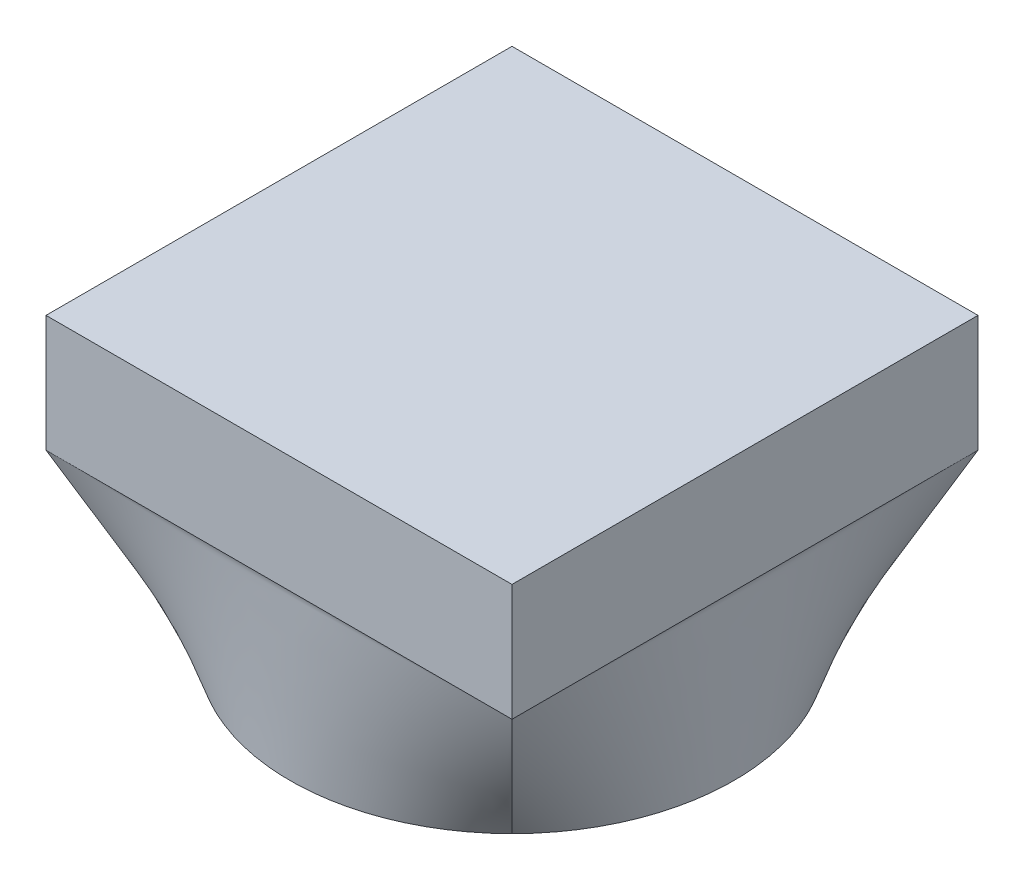
ISO-10303-21;
HEADER;
FILE_DESCRIPTION(('STEP AP214'),'2;1');
FILE_NAME('part.step','',(''),(''),'','','');
FILE_SCHEMA(('AUTOMOTIVE_DESIGN { 1 0 10303 214 1 1 1 1 }'));
ENDSEC;
DATA;
#1=APPLICATION_CONTEXT('core data for automotive mechanical design processes');
#2=APPLICATION_PROTOCOL_DEFINITION('international standard','automotive_design',2000,#1);
#3=PRODUCT_CONTEXT('',#1,'mechanical');
#4=PRODUCT('Part','Part','',(#3));
#5=PRODUCT_RELATED_PRODUCT_CATEGORY('part','',(#4));
#6=PRODUCT_DEFINITION_FORMATION('','',#4);
#7=PRODUCT_DEFINITION_CONTEXT('part definition',#1,'design');
#8=PRODUCT_DEFINITION('design','',#6,#7);
#9=PRODUCT_DEFINITION_SHAPE('','',#8);
#10=(LENGTH_UNIT() NAMED_UNIT(*) SI_UNIT(.MILLI.,.METRE.));
#11=(NAMED_UNIT(*) PLANE_ANGLE_UNIT() SI_UNIT($,.RADIAN.));
#12=(NAMED_UNIT(*) SI_UNIT($,.STERADIAN.) SOLID_ANGLE_UNIT());
#13=UNCERTAINTY_MEASURE_WITH_UNIT(LENGTH_MEASURE(1.E-05),#10,'distance_accuracy_value','');
#14=(GEOMETRIC_REPRESENTATION_CONTEXT(3) GLOBAL_UNCERTAINTY_ASSIGNED_CONTEXT((#13)) GLOBAL_UNIT_ASSIGNED_CONTEXT((#10,
#11,#12)) REPRESENTATION_CONTEXT('',''));
#15=CARTESIAN_POINT('',(0.,0.,0.));
#16=DIRECTION('',(0.,0.,1.));
#17=DIRECTION('',(1.,0.,0.));
#18=AXIS2_PLACEMENT_3D('',#15,#16,#17);
#19=CARTESIAN_POINT('',(0.,0.5,0.));
#20=DIRECTION('',(0.,-1.,0.));
#21=DIRECTION('',(0.,0.,-1.));
#22=AXIS2_PLACEMENT_3D('',#19,#20,#21);
#23=PLANE('',#22);
#24=CARTESIAN_POINT('',(0.,0.5,0.));
#25=DIRECTION('',(0.,-1.,0.));
#26=DIRECTION('',(0.,0.,-1.));
#27=AXIS2_PLACEMENT_3D('',#24,#25,#26);
#28=CIRCLE('',#27,6.86602540378444);
#29=CARTESIAN_POINT('',(0.,0.5,-6.86602540378444));
#30=VERTEX_POINT('',#29);
#31=EDGE_CURVE('E12',#30,#30,#28,.F.);
#32=ORIENTED_EDGE('',*,*,#31,.T.);
#33=EDGE_LOOP('',(#32));
#34=FACE_BOUND('',#33,.T.);
#35=CARTESIAN_POINT('',(6.7175144212722,0.5,-6.7175144212722));
#36=CARTESIAN_POINT('',(6.90300651074698,0.5,-6.53196568316095));
#37=CARTESIAN_POINT('',(7.08082919478799,0.5,-6.3387355064062));
#38=CARTESIAN_POINT('',(7.41990694543301,0.5,-5.938268848841));
#39=CARTESIAN_POINT('',(7.5811629987396,0.5,-5.73103320341146));
#40=CARTESIAN_POINT('',(7.88580839880782,0.5,-5.30401965513411));
#41=CARTESIAN_POINT('',(8.02920855368413,0.5,-5.08424945803837));
#42=CARTESIAN_POINT('',(8.2974001505958,0.5,-4.63360021934996));
#43=CARTESIAN_POINT('',(8.42219150037817,0.5,-4.40272112269252));
#44=CARTESIAN_POINT('',(8.59584911084859,0.5,-4.04707128404822));
#45=CARTESIAN_POINT('',(8.65194123204583,0.5,-3.92578045496589));
#46=CARTESIAN_POINT('',(8.75891814617632,0.5,-3.68092361255744));
#47=CARTESIAN_POINT('',(8.80980293558919,0.5,-3.55735759769326));
#48=CARTESIAN_POINT('',(8.9545676189336,0.5,-3.18361211438249));
#49=CARTESIAN_POINT('',(9.04058163339784,0.5,-2.93033639673166));
#50=CARTESIAN_POINT('',(9.19105454991117,0.5,-2.41752533703896));
#51=CARTESIAN_POINT('',(9.25551638224249,0.5,-2.15799085110165));
#52=CARTESIAN_POINT('',(9.36215700002169,0.5,-1.63438703119353));
#53=CARTESIAN_POINT('',(9.4043359782232,0.5,-1.37031773647064));
#54=CARTESIAN_POINT('',(9.46641842680962,0.5,-0.839844175415977));
#55=CARTESIAN_POINT('',(9.48634661268615,0.5,-0.573442831748017));
#56=CARTESIAN_POINT('',(9.49934263708747,0.5,-0.173352287448569));
#57=CARTESIAN_POINT('',(9.50085781792093,0.5,-0.039892222514214));
#58=CARTESIAN_POINT('',(9.49821245225879,0.5,0.226971912535523));
#59=CARTESIAN_POINT('',(9.4940518701228,0.5,0.360375982294027));
#60=CARTESIAN_POINT('',(9.47316806180636,0.5,0.760178258755879));
#61=CARTESIAN_POINT('',(9.44804334386136,0.5,1.02618451527658));
#62=CARTESIAN_POINT('',(9.37557644209928,0.5,1.55512165677982));
#63=CARTESIAN_POINT('',(9.32823459128378,0.5,1.81805258779635));
#64=CARTESIAN_POINT('',(9.21137624255906,0.5,2.33914102224138));
#65=CARTESIAN_POINT('',(9.14184405024454,0.5,2.59729500998239));
#66=CARTESIAN_POINT('',(8.98144078615444,0.5,3.10690129125351));
#67=CARTESIAN_POINT('',(8.8905684472608,0.5,3.35835318584452));
#68=CARTESIAN_POINT('',(8.68788921287397,0.5,3.85252457294979));
#69=CARTESIAN_POINT('',(8.57609281841009,0.5,4.09524837325235));
#70=CARTESIAN_POINT('',(8.33251254082136,0.5,4.57043816222572));
#71=CARTESIAN_POINT('',(8.20073081745608,0.5,4.80290525581053));
#72=CARTESIAN_POINT('',(7.96402170854364,0.5,5.18231400915458));
#73=CARTESIAN_POINT('',(7.86427190542111,0.5,5.33251293162386));
#74=CARTESIAN_POINT('',(7.65636447383926,0.5,5.62694084069753));
#75=CARTESIAN_POINT('',(7.54820857442066,0.5,5.77117104569698));
#76=CARTESIAN_POINT('',(7.3240486557897,0.5,6.05306969086165));
#77=CARTESIAN_POINT('',(7.20805563336533,0.5,6.19074688163188));
#78=CARTESIAN_POINT('',(6.96842469610688,0.5,6.45933024422766));
#79=CARTESIAN_POINT('',(6.84478519676399,0.5,6.59023500227353));
#80=CARTESIAN_POINT('',(6.7175144212722,0.5,6.7175144212722));
#81=B_SPLINE_CURVE_WITH_KNOTS('',3,(#35,#36,#37,#38,#39,#40,#41,#42,#43,#44,#45,#46,#47,#48,#49,
#50,#51,#52,#53,#54,#55,#56,#57,#58,#59,#60,#61,#62,#63,#64,#65,#66,#67,#68,#69,#70,#71,#72,#73,
#74,#75,#76,#77,#78,#79,#80),.UNSPECIFIED.,.F.,.F.,(4,2,2,2,2,2,2,2,2,2,2,2,2,2,2,2,2,2,2,2,2,2,
4),(0.,0.786892929638783,1.57373896501321,2.36010638570078,3.14647770466848,3.54727241249081,
3.94806739126557,4.74949495785004,5.55081351622108,6.35212514282349,7.15254580904471,
7.55284674077699,7.95315018617001,8.75370327486,9.55424436483984,10.3553529073075,
11.1565090293859,11.9572641530042,12.7579328027999,13.2985776240309,13.8391115334338,
14.3789021329941,14.9188049656204),.UNSPECIFIED.);
#82=CARTESIAN_POINT('',(6.7175144212722,0.5,-6.7175144212722));
#83=VERTEX_POINT('',#82);
#84=CARTESIAN_POINT('',(6.7175144212722,0.5,6.7175144212722));
#85=VERTEX_POINT('',#84);
#86=EDGE_CURVE('E101',#83,#85,#81,.T.);
#87=ORIENTED_EDGE('',*,*,#86,.T.);
#88=CARTESIAN_POINT('',(-6.7175144212722,0.5,6.7175144212722));
#89=CARTESIAN_POINT('',(-6.53196568316094,0.5,6.90300651074699));
#90=CARTESIAN_POINT('',(-6.33873550640619,0.5,7.080829194788));
#91=CARTESIAN_POINT('',(-5.93826884884098,0.5,7.41990694543302));
#92=CARTESIAN_POINT('',(-5.73103320341144,0.5,7.58116299873962));
#93=CARTESIAN_POINT('',(-5.30401965513409,0.5,7.88580839880784));
#94=CARTESIAN_POINT('',(-5.08424945803834,0.5,8.02920855368415));
#95=CARTESIAN_POINT('',(-4.63360021934992,0.5,8.29740015059582));
#96=CARTESIAN_POINT('',(-4.40272112269248,0.5,8.42219150037819));
#97=CARTESIAN_POINT('',(-4.04707128404817,0.5,8.59584911084862));
#98=CARTESIAN_POINT('',(-3.92578045496584,0.5,8.65194123204586));
#99=CARTESIAN_POINT('',(-3.68092361255738,0.5,8.75891814617635));
#100=CARTESIAN_POINT('',(-3.55735759769319,0.5,8.80980293558922));
#101=CARTESIAN_POINT('',(-3.18361211438241,0.5,8.95456761893364));
#102=CARTESIAN_POINT('',(-2.93033639673157,0.5,9.04058163339787));
#103=CARTESIAN_POINT('',(-2.41752533703884,0.5,9.1910545499112));
#104=CARTESIAN_POINT('',(-2.15799085110152,0.5,9.25551638224252));
#105=CARTESIAN_POINT('',(-1.63438703119338,0.5,9.36215700002171));
#106=CARTESIAN_POINT('',(-1.37031773647048,0.5,9.40433597822322));
#107=CARTESIAN_POINT('',(-0.839844175415804,0.5,9.46641842680963));
#108=CARTESIAN_POINT('',(-0.573442831747839,0.5,9.48634661268616));
#109=CARTESIAN_POINT('',(-0.173352287448387,0.5,9.49934263708748));
#110=CARTESIAN_POINT('',(-0.0398922225140296,0.5,9.50085781792093));
#111=CARTESIAN_POINT('',(0.226971912535711,0.5,9.49821245225878));
#112=CARTESIAN_POINT('',(0.360375982294216,0.5,9.49405187012279));
#113=CARTESIAN_POINT('',(0.760178258756073,0.5,9.47316806180634));
#114=CARTESIAN_POINT('',(1.02618451527678,0.5,9.44804334386134));
#115=CARTESIAN_POINT('',(1.55512165678002,0.5,9.37557644209925));
#116=CARTESIAN_POINT('',(1.81805258779655,0.5,9.32823459128375));
#117=CARTESIAN_POINT('',(2.33914102224158,0.5,9.211376242559));
#118=CARTESIAN_POINT('',(2.59729500998259,0.5,9.14184405024449));
#119=CARTESIAN_POINT('',(3.1069012912537,0.5,8.98144078615437));
#120=CARTESIAN_POINT('',(3.3583531858447,0.5,8.89056844726073));
#121=CARTESIAN_POINT('',(3.85252457294997,0.5,8.68788921287389));
#122=CARTESIAN_POINT('',(4.09524837325252,0.5,8.57609281841001));
#123=CARTESIAN_POINT('',(4.57043816222588,0.5,8.33251254082127));
#124=CARTESIAN_POINT('',(4.80290525581069,0.5,8.20073081745599));
#125=CARTESIAN_POINT('',(5.18231400915472,0.5,7.96402170854355));
#126=CARTESIAN_POINT('',(5.33251293162399,0.5,7.86427190542103));
#127=CARTESIAN_POINT('',(5.62694084069763,0.5,7.65636447383919));
#128=CARTESIAN_POINT('',(5.77117104569707,0.5,7.54820857442059));
#129=CARTESIAN_POINT('',(6.05306969086171,0.5,7.32404865578965));
#130=CARTESIAN_POINT('',(6.19074688163193,0.5,7.20805563336529));
#131=CARTESIAN_POINT('',(6.45933024422768,0.5,6.96842469610686));
#132=CARTESIAN_POINT('',(6.59023500227354,0.5,6.84478519676398));
#133=CARTESIAN_POINT('',(6.7175144212722,0.5,6.7175144212722));
#134=B_SPLINE_CURVE_WITH_KNOTS('',3,(#88,#89,#90,#91,#92,#93,#94,#95,#96,#97,#98,#99,#100,#101,
#102,#103,#104,#105,#106,#107,#108,#109,#110,#111,#112,#113,#114,#115,#116,#117,#118,#119,#120,
#121,#122,#123,#124,#125,#126,#127,#128,#129,#130,#131,#132,#133),.UNSPECIFIED.,.F.,.F.,(4,2,2,
2,2,2,2,2,2,2,2,2,2,2,2,2,2,2,2,2,2,2,4),(0.,0.786892929638797,1.57373896501323,
2.36010638570082,3.14647770466853,3.54727241249088,3.94806739126565,4.74949495785015,
5.55081351622122,6.35212514282366,7.15254580904489,7.55284674077717,7.9531501861702,
8.7537032748602,9.55424436484005,10.3553529073077,11.1565090293861,11.9572641530044,
12.7579328028001,13.298577624031,13.8391115334339,14.3789021329942,14.9188049656204),.UNSPECIFIED.);
#135=CARTESIAN_POINT('',(-6.7175144212722,0.5,6.7175144212722));
#136=VERTEX_POINT('',#135);
#137=EDGE_CURVE('E198',#136,#85,#134,.T.);
#138=ORIENTED_EDGE('',*,*,#137,.F.);
#139=CARTESIAN_POINT('',(-6.7175144212722,0.5,-6.7175144212722));
#140=CARTESIAN_POINT('',(-6.90300651074699,0.5,-6.53196568316095));
#141=CARTESIAN_POINT('',(-7.080829194788,0.5,-6.33873550640619));
#142=CARTESIAN_POINT('',(-7.41990694543302,0.5,-5.93826884884099));
#143=CARTESIAN_POINT('',(-7.58116299873961,0.5,-5.73103320341145));
#144=CARTESIAN_POINT('',(-7.88580839880783,0.5,-5.3040196551341));
#145=CARTESIAN_POINT('',(-8.02920855368414,0.5,-5.08424945803835));
#146=CARTESIAN_POINT('',(-8.29740015059581,0.5,-4.63360021934994));
#147=CARTESIAN_POINT('',(-8.42219150037818,0.5,-4.4027211226925));
#148=CARTESIAN_POINT('',(-8.59584911084861,0.5,-4.04707128404819));
#149=CARTESIAN_POINT('',(-8.65194123204585,0.5,-3.92578045496586));
#150=CARTESIAN_POINT('',(-8.75891814617634,0.5,-3.6809236125574));
#151=CARTESIAN_POINT('',(-8.80980293558921,0.5,-3.55735759769322));
#152=CARTESIAN_POINT('',(-8.95456761893363,0.5,-3.18361211438243));
#153=CARTESIAN_POINT('',(-9.04058163339787,0.5,-2.93033639673159));
#154=CARTESIAN_POINT('',(-9.19105454991119,0.5,-2.41752533703887));
#155=CARTESIAN_POINT('',(-9.25551638224251,0.5,-2.15799085110154));
#156=CARTESIAN_POINT('',(-9.36215700002171,0.5,-1.63438703119341));
#157=CARTESIAN_POINT('',(-9.40433597822322,0.5,-1.3703177364705));
#158=CARTESIAN_POINT('',(-9.46641842680963,0.5,-0.839844175415837));
#159=CARTESIAN_POINT('',(-9.48634661268616,0.5,-0.573442831747878));
#160=CARTESIAN_POINT('',(-9.49934263708747,0.5,-0.173352287448433));
#161=CARTESIAN_POINT('',(-9.50085781792093,0.5,-0.0398922225140783));
#162=CARTESIAN_POINT('',(-9.49821245225878,0.5,0.226971912535657));
#163=CARTESIAN_POINT('',(-9.4940518701228,0.5,0.36037598229416));
#164=CARTESIAN_POINT('',(-9.47316806180635,0.5,0.760178258756009));
#165=CARTESIAN_POINT('',(-9.44804334386134,0.5,1.02618451527671));
#166=CARTESIAN_POINT('',(-9.37557644209926,0.5,1.55512165677994));
#167=CARTESIAN_POINT('',(-9.32823459128376,0.5,1.81805258779647));
#168=CARTESIAN_POINT('',(-9.21137624255902,0.5,2.33914102224149));
#169=CARTESIAN_POINT('',(-9.14184405024451,0.5,2.59729500998251));
#170=CARTESIAN_POINT('',(-8.9814407861544,0.5,3.10690129125362));
#171=CARTESIAN_POINT('',(-8.89056844726076,0.5,3.35835318584463));
#172=CARTESIAN_POINT('',(-8.68788921287393,0.5,3.8525245729499));
#173=CARTESIAN_POINT('',(-8.57609281841005,0.5,4.09524837325245));
#174=CARTESIAN_POINT('',(-8.33251254082131,0.5,4.57043816222582));
#175=CARTESIAN_POINT('',(-8.20073081745603,0.5,4.80290525581062));
#176=CARTESIAN_POINT('',(-7.96402170854359,0.5,5.18231400915466));
#177=CARTESIAN_POINT('',(-7.86427190542106,0.5,5.33251293162394));
#178=CARTESIAN_POINT('',(-7.65636447383922,0.5,5.62694084069759));
#179=CARTESIAN_POINT('',(-7.54820857442062,0.5,5.77117104569704));
#180=CARTESIAN_POINT('',(-7.32404865578967,0.5,6.05306969086169));
#181=CARTESIAN_POINT('',(-7.2080556333653,0.5,6.19074688163191));
#182=CARTESIAN_POINT('',(-6.96842469610687,0.5,6.45933024422767));
#183=CARTESIAN_POINT('',(-6.84478519676399,0.5,6.59023500227354));
#184=CARTESIAN_POINT('',(-6.7175144212722,0.5,6.7175144212722));
#185=B_SPLINE_CURVE_WITH_KNOTS('',3,(#139,#140,#141,#142,#143,#144,#145,#146,#147,#148,#149,
#150,#151,#152,#153,#154,#155,#156,#157,#158,#159,#160,#161,#162,#163,#164,#165,#166,#167,#168,
#169,#170,#171,#172,#173,#174,#175,#176,#177,#178,#179,#180,#181,#182,#183,#184),.UNSPECIFIED.,
.F.,.F.,(4,2,2,2,2,2,2,2,2,2,2,2,2,2,2,2,2,2,2,2,2,2,4),(0.,0.786892929638792,1.57373896501322,
2.3601063857008,3.14647770466851,3.54727241249085,3.94806739126562,4.74949495785013,
5.55081351622119,6.35212514282363,7.15254580904484,7.55284674077712,7.95315018617014,
8.75370327486013,9.55424436483996,10.3553529073076,11.156509029386,11.9572641530043,
12.7579328028,13.298577624031,13.8391115334339,14.3789021329942,14.9188049656204),.UNSPECIFIED.);
#186=CARTESIAN_POINT('',(-6.7175144212722,0.5,-6.7175144212722));
#187=VERTEX_POINT('',#186);
#188=EDGE_CURVE('E222',#187,#136,#185,.T.);
#189=ORIENTED_EDGE('',*,*,#188,.F.);
#190=CARTESIAN_POINT('',(6.7175144212722,0.5,-6.7175144212722));
#191=CARTESIAN_POINT('',(6.53196568316096,0.5,-6.90300651074698));
#192=CARTESIAN_POINT('',(6.33873550640621,0.5,-7.08082919478798));
#193=CARTESIAN_POINT('',(5.93826884884102,0.5,-7.41990694543299));
#194=CARTESIAN_POINT('',(5.73103320341149,0.5,-7.58116299873958));
#195=CARTESIAN_POINT('',(5.30401965513416,0.5,-7.88580839880779));
#196=CARTESIAN_POINT('',(5.08424945803842,0.5,-8.0292085536841));
#197=CARTESIAN_POINT('',(4.63360021935003,0.5,-8.29740015059576));
#198=CARTESIAN_POINT('',(4.4027211226926,0.5,-8.42219150037812));
#199=CARTESIAN_POINT('',(4.04707128404831,0.5,-8.59584911084855));
#200=CARTESIAN_POINT('',(3.92578045496598,0.5,-8.65194123204579));
#201=CARTESIAN_POINT('',(3.68092361255753,0.5,-8.75891814617628));
#202=CARTESIAN_POINT('',(3.55735759769335,0.5,-8.80980293558915));
#203=CARTESIAN_POINT('',(3.18361211438258,0.5,-8.95456761893357));
#204=CARTESIAN_POINT('',(2.93033639673176,0.5,-9.04058163339781));
#205=CARTESIAN_POINT('',(2.41752533703905,0.5,-9.19105454991114));
#206=CARTESIAN_POINT('',(2.15799085110174,0.5,-9.25551638224246));
#207=CARTESIAN_POINT('',(1.63438703119363,0.5,-9.36215700002167));
#208=CARTESIAN_POINT('',(1.37031773647074,0.5,-9.40433597822319));
#209=CARTESIAN_POINT('',(0.839844175416073,0.5,-9.46641842680961));
#210=CARTESIAN_POINT('',(0.573442831748105,0.5,-9.48634661268614));
#211=CARTESIAN_POINT('',(0.173352287448647,0.5,-9.49934263708747));
#212=CARTESIAN_POINT('',(0.0398922225142885,0.5,-9.50085781792093));
#213=CARTESIAN_POINT('',(-0.226971912535455,0.5,-9.49821245225879));
#214=CARTESIAN_POINT('',(-0.360375982293963,0.5,-9.4940518701228));
#215=CARTESIAN_POINT('',(-0.760178258755826,0.5,-9.47316806180636));
#216=CARTESIAN_POINT('',(-1.02618451527654,0.5,-9.44804334386137));
#217=CARTESIAN_POINT('',(-1.55512165677979,0.5,-9.37557644209929));
#218=CARTESIAN_POINT('',(-1.81805258779632,0.5,-9.32823459128379));
#219=CARTESIAN_POINT('',(-2.33914102224135,0.5,-9.21137624255906));
#220=CARTESIAN_POINT('',(-2.59729500998237,0.5,-9.14184405024455));
#221=CARTESIAN_POINT('',(-3.10690129125347,0.5,-8.98144078615445));
#222=CARTESIAN_POINT('',(-3.35835318584448,0.5,-8.89056844726081));
#223=CARTESIAN_POINT('',(-3.85252457294974,0.5,-8.687889212874));
#224=CARTESIAN_POINT('',(-4.0952483732523,0.5,-8.57609281841011));
#225=CARTESIAN_POINT('',(-4.57043816222566,0.5,-8.33251254082139));
#226=CARTESIAN_POINT('',(-4.80290525581047,0.5,-8.20073081745612));
#227=CARTESIAN_POINT('',(-5.18231400915452,0.5,-7.96402170854368));
#228=CARTESIAN_POINT('',(-5.33251293162381,0.5,-7.86427190542115));
#229=CARTESIAN_POINT('',(-5.62694084069749,0.5,-7.65636447383929));
#230=CARTESIAN_POINT('',(-5.77117104569695,0.5,-7.54820857442069));
#231=CARTESIAN_POINT('',(-6.05306969086163,0.5,-7.32404865578972));
#232=CARTESIAN_POINT('',(-6.19074688163187,0.5,-7.20805563336534));
#233=CARTESIAN_POINT('',(-6.45933024422765,0.5,-6.96842469610689));
#234=CARTESIAN_POINT('',(-6.59023500227353,0.5,-6.844785196764));
#235=CARTESIAN_POINT('',(-6.7175144212722,0.5,-6.7175144212722));
#236=B_SPLINE_CURVE_WITH_KNOTS('',3,(#190,#191,#192,#193,#194,#195,#196,#197,#198,#199,#200,
#201,#202,#203,#204,#205,#206,#207,#208,#209,#210,#211,#212,#213,#214,#215,#216,#217,#218,#219,
#220,#221,#222,#223,#224,#225,#226,#227,#228,#229,#230,#231,#232,#233,#234,#235),.UNSPECIFIED.,
.F.,.F.,(4,2,2,2,2,2,2,2,2,2,2,2,2,2,2,2,2,2,2,2,2,2,4),(0.,0.78689292963876,1.57373896501316,
2.36010638570071,3.14647770466839,3.54727241249071,3.94806739126547,4.74949495784994,
5.55081351622098,6.35212514282338,7.15254580904463,7.55284674077691,7.95315018616995,
8.75370327485996,9.55424436483982,10.3553529073074,11.1565090293859,11.9572641530042,
12.7579328027998,13.2985776240308,13.8391115334338,14.3789021329941,14.9188049656204),.UNSPECIFIED.);
#237=EDGE_CURVE('E186',#83,#187,#236,.T.);
#238=ORIENTED_EDGE('',*,*,#237,.F.);
#239=EDGE_LOOP('',(#87,#138,#189,#238));
#240=FACE_BOUND('',#239,.T.);
#241=ADVANCED_FACE('F66',(#34,#240),#23,.T.);
#242=CARTESIAN_POINT('',(0.,0.,0.));
#243=DIRECTION('',(0.,1.,0.));
#244=DIRECTION('',(0.,0.,1.));
#245=AXIS2_PLACEMENT_3D('',#242,#243,#244);
#246=PLANE('',#245);
#247=CARTESIAN_POINT('',(0.,0.,0.));
#248=DIRECTION('',(0.,-1.,0.));
#249=DIRECTION('',(0.,0.,-1.));
#250=AXIS2_PLACEMENT_3D('',#247,#248,#249);
#251=CIRCLE('',#250,3.9);
#252=CARTESIAN_POINT('',(0.,0.,-3.9));
#253=VERTEX_POINT('',#252);
#254=EDGE_CURVE('E335',#253,#253,#251,.T.);
#255=ORIENTED_EDGE('',*,*,#254,.F.);
#256=EDGE_LOOP('',(#255));
#257=FACE_BOUND('',#256,.T.);
#258=CARTESIAN_POINT('',(0.,0.,0.));
#259=DIRECTION('',(0.,-1.,0.));
#260=DIRECTION('',(0.,0.,-1.));
#261=AXIS2_PLACEMENT_3D('',#258,#259,#260);
#262=CIRCLE('',#261,6.);
#263=CARTESIAN_POINT('',(0.,0.,-6.));
#264=VERTEX_POINT('',#263);
#265=EDGE_CURVE('E75',#264,#264,#262,.T.);
#266=ORIENTED_EDGE('',*,*,#265,.T.);
#267=EDGE_LOOP('',(#266));
#268=FACE_BOUND('',#267,.T.);
#269=ADVANCED_FACE('F213',(#257,#268),#246,.F.);
#270=CARTESIAN_POINT('',(6.7175144212722,0.5,-6.7175144212722));
#271=CARTESIAN_POINT('',(9.975,8.,-9.975));
#272=CARTESIAN_POINT('',(6.32168108793887,0.5,-7.11334775460554));
#273=CARTESIAN_POINT('',(9.14375000000001,8.,-9.975));
#274=CARTESIAN_POINT('',(5.87585631433432,0.5,-7.48879518154313));
#275=CARTESIAN_POINT('',(8.31250000000002,8.,-9.975));
#276=CARTESIAN_POINT('',(4.89020081393652,0.5,-8.16661966159688));
#277=CARTESIAN_POINT('',(6.65000000000003,8.,-9.975));
#278=CARTESIAN_POINT('',(4.35031975216273,0.5,-8.46877725249614));
#279=CARTESIAN_POINT('',(5.81875000000003,8.,-9.975));
#280=CARTESIAN_POINT('',(3.19604985031962,0.5,-8.96831842948973));
#281=CARTESIAN_POINT('',(4.15625000000004,8.,-9.975));
#282=CARTESIAN_POINT('',(2.58175137902643,0.5,-9.16545716669191));
#283=CARTESIAN_POINT('',(3.32500000000005,8.,-9.975));
#284=CARTESIAN_POINT('',(1.31152863562535,0.5,-9.43138048726186));
#285=CARTESIAN_POINT('',(1.66250000000005,8.,-9.975));
#286=CARTESIAN_POINT('',(0.655838140424066,0.5,-9.5));
#287=CARTESIAN_POINT('',(0.831250000000053,8.,-9.975));
#288=CARTESIAN_POINT('',(-0.655838140424068,0.5,-9.5));
#289=CARTESIAN_POINT('',(-0.831249999999947,8.,-9.975));
#290=CARTESIAN_POINT('',(-1.31152863562535,0.5,-9.43138048726186));
#291=CARTESIAN_POINT('',(-1.66249999999995,8.,-9.975));
#292=CARTESIAN_POINT('',(-2.58175137902643,0.5,-9.16545716669191));
#293=CARTESIAN_POINT('',(-3.32499999999996,8.,-9.975));
#294=CARTESIAN_POINT('',(-3.19604985031962,0.5,-8.96831842948973));
#295=CARTESIAN_POINT('',(-4.15624999999996,8.,-9.975));
#296=CARTESIAN_POINT('',(-4.35031975216273,0.5,-8.46877725249614));
#297=CARTESIAN_POINT('',(-5.81874999999997,8.,-9.975));
#298=CARTESIAN_POINT('',(-4.89020081393652,0.5,-8.16661966159688));
#299=CARTESIAN_POINT('',(-6.64999999999997,8.,-9.975));
#300=CARTESIAN_POINT('',(-5.87585631433433,0.5,-7.48879518154313));
#301=CARTESIAN_POINT('',(-8.31249999999998,8.,-9.975));
#302=CARTESIAN_POINT('',(-6.32168108793887,0.5,-7.11334775460553));
#303=CARTESIAN_POINT('',(-9.14374999999999,8.,-9.975));
#304=CARTESIAN_POINT('',(-6.7175144212722,0.5,-6.7175144212722));
#305=CARTESIAN_POINT('',(-9.975,8.,-9.975));
#306=B_SPLINE_SURFACE_WITH_KNOTS('',3,1,((#270,#271),(#272,#273),(#274,#275),(#276,#277),(#278,
#279),(#280,#281),(#282,#283),(#284,#285),(#286,#287),(#288,#289),(#290,#291),(#292,#293),(#294,
#295),(#296,#297),(#298,#299),(#300,#301),(#302,#303),(#304,#305)),.UNSPECIFIED.,.F.,.F.,.F.,(4,
2,2,2,2,2,2,2,4),(2,2),(0.,0.125,0.25,0.375,0.5,0.625,0.75,0.875,1.),(0.,1.),.UNSPECIFIED.);
#307=DIRECTION('',(-0.370091344143309,0.852094357439596,-0.370091344143309));
#308=VECTOR('',#307,1.);
#309=CARTESIAN_POINT('',(-8.3462572106361,4.25,-8.3462572106361));
#310=LINE('',#309,#308);
#311=CARTESIAN_POINT('',(-9.975,8.,-9.975));
#312=VERTEX_POINT('',#311);
#313=EDGE_CURVE('E83',#187,#312,#310,.T.);
#314=CARTESIAN_POINT('',(-9.975,8.,-9.975));
#315=CARTESIAN_POINT('',(-9.14374999999999,8.,-9.975));
#316=CARTESIAN_POINT('',(-8.31249999999998,8.,-9.975));
#317=CARTESIAN_POINT('',(-6.64999999999997,8.,-9.975));
#318=CARTESIAN_POINT('',(-5.81874999999997,8.,-9.975));
#319=CARTESIAN_POINT('',(-4.15624999999996,8.,-9.975));
#320=CARTESIAN_POINT('',(-3.32499999999996,8.,-9.975));
#321=CARTESIAN_POINT('',(-1.66249999999995,8.,-9.975));
#322=CARTESIAN_POINT('',(-0.831249999999947,8.,-9.975));
#323=CARTESIAN_POINT('',(0.831250000000053,8.,-9.975));
#324=CARTESIAN_POINT('',(1.66250000000005,8.,-9.975));
#325=CARTESIAN_POINT('',(3.32500000000005,8.,-9.975));
#326=CARTESIAN_POINT('',(4.15625000000004,8.,-9.975));
#327=CARTESIAN_POINT('',(5.81875000000003,8.,-9.975));
#328=CARTESIAN_POINT('',(6.65000000000003,8.,-9.975));
#329=CARTESIAN_POINT('',(8.31250000000002,8.,-9.975));
#330=CARTESIAN_POINT('',(9.14375000000001,8.,-9.975));
#331=CARTESIAN_POINT('',(9.975,8.,-9.975));
#332=B_SPLINE_CURVE_WITH_KNOTS('',3,(#314,#315,#316,#317,#318,#319,#320,#321,#322,#323,#324,
#325,#326,#327,#328,#329,#330,#331),.UNSPECIFIED.,.F.,.F.,(4,2,2,2,2,2,2,2,4),(0.,0.125,0.25,
0.375,0.5,0.625,0.75,0.875,1.),.UNSPECIFIED.);
#333=CARTESIAN_POINT('',(9.975,8.,-9.975));
#334=VERTEX_POINT('',#333);
#335=EDGE_CURVE('E263',#312,#334,#332,.T.);
#336=DIRECTION('',(-0.370091344143308,-0.852094357439596,0.370091344143308));
#337=VECTOR('',#336,1.);
#338=CARTESIAN_POINT('',(8.3462572106361,4.25,-8.3462572106361));
#339=LINE('',#338,#337);
#340=EDGE_CURVE('E286',#334,#83,#339,.T.);
#341=ORIENTED_EDGE('',*,*,#237,.T.);
#342=ORIENTED_EDGE('',*,*,#313,.T.);
#343=ORIENTED_EDGE('',*,*,#335,.T.);
#344=ORIENTED_EDGE('',*,*,#340,.T.);
#345=EDGE_LOOP('',(#341,#342,#343,#344));
#346=FACE_BOUND('',#345,.T.);
#347=ADVANCED_FACE('F205',(#346),#306,.T.);
#348=CARTESIAN_POINT('',(-6.7175144212722,0.5,-6.7175144212722));
#349=CARTESIAN_POINT('',(-9.975,8.,-9.975));
#350=CARTESIAN_POINT('',(-7.11334775460553,0.5,-6.32168108793886));
#351=CARTESIAN_POINT('',(-9.975,8.,-9.14374999999999));
#352=CARTESIAN_POINT('',(-7.48879518154313,0.5,-5.87585631433432));
#353=CARTESIAN_POINT('',(-9.975,8.,-8.31249999999999));
#354=CARTESIAN_POINT('',(-8.16661966159688,0.5,-4.89020081393652));
#355=CARTESIAN_POINT('',(-9.975,8.,-6.64999999999998));
#356=CARTESIAN_POINT('',(-8.46877725249615,0.5,-4.35031975216273));
#357=CARTESIAN_POINT('',(-9.975,8.,-5.81874999999998));
#358=CARTESIAN_POINT('',(-8.96831842948974,0.5,-3.19604985031962));
#359=CARTESIAN_POINT('',(-9.975,8.,-4.15624999999998));
#360=CARTESIAN_POINT('',(-9.16545716669192,0.5,-2.58175137902643));
#361=CARTESIAN_POINT('',(-9.975,8.,-3.32499999999997));
#362=CARTESIAN_POINT('',(-9.43138048726186,0.5,-1.31152863562534));
#363=CARTESIAN_POINT('',(-9.975,8.,-1.66249999999997));
#364=CARTESIAN_POINT('',(-9.5,0.5,-0.655838140424065));
#365=CARTESIAN_POINT('',(-9.975,8.,-0.831249999999971));
#366=CARTESIAN_POINT('',(-9.5,0.5,0.655838140424069));
#367=CARTESIAN_POINT('',(-9.975,8.,0.831250000000028));
#368=CARTESIAN_POINT('',(-9.43138048726186,0.5,1.31152863562535));
#369=CARTESIAN_POINT('',(-9.975,8.,1.66250000000003));
#370=CARTESIAN_POINT('',(-9.16545716669191,0.5,2.58175137902643));
#371=CARTESIAN_POINT('',(-9.975,8.,3.32500000000003));
#372=CARTESIAN_POINT('',(-8.96831842948973,0.5,3.19604985031962));
#373=CARTESIAN_POINT('',(-9.975,8.,4.15625000000002));
#374=CARTESIAN_POINT('',(-8.46877725249614,0.5,4.35031975216273));
#375=CARTESIAN_POINT('',(-9.975,8.,5.81875000000002));
#376=CARTESIAN_POINT('',(-8.16661966159688,0.5,4.89020081393652));
#377=CARTESIAN_POINT('',(-9.975,8.,6.65000000000002));
#378=CARTESIAN_POINT('',(-7.48879518154313,0.5,5.87585631433433));
#379=CARTESIAN_POINT('',(-9.975,8.,8.31250000000001));
#380=CARTESIAN_POINT('',(-7.11334775460554,0.5,6.32168108793887));
#381=CARTESIAN_POINT('',(-9.975,8.,9.14375000000001));
#382=CARTESIAN_POINT('',(-6.7175144212722,0.5,6.7175144212722));
#383=CARTESIAN_POINT('',(-9.975,8.,9.975));
#384=B_SPLINE_SURFACE_WITH_KNOTS('',3,1,((#348,#349),(#350,#351),(#352,#353),(#354,#355),(#356,
#357),(#358,#359),(#360,#361),(#362,#363),(#364,#365),(#366,#367),(#368,#369),(#370,#371),(#372,
#373),(#374,#375),(#376,#377),(#378,#379),(#380,#381),(#382,#383)),.UNSPECIFIED.,.F.,.F.,.F.,(4,
2,2,2,2,2,2,2,4),(2,2),(0.,0.125,0.25,0.375,0.5,0.625,0.75,0.875,1.),(0.,1.),.UNSPECIFIED.);
#385=DIRECTION('',(-0.370091344143309,0.852094357439596,0.370091344143309));
#386=VECTOR('',#385,1.);
#387=CARTESIAN_POINT('',(-8.3462572106361,4.25,8.3462572106361));
#388=LINE('',#387,#386);
#389=CARTESIAN_POINT('',(-9.975,8.,9.975));
#390=VERTEX_POINT('',#389);
#391=EDGE_CURVE('E107',#136,#390,#388,.T.);
#392=CARTESIAN_POINT('',(-9.975,8.,9.975));
#393=CARTESIAN_POINT('',(-9.975,8.,9.14375000000001));
#394=CARTESIAN_POINT('',(-9.975,8.,8.31250000000001));
#395=CARTESIAN_POINT('',(-9.975,8.,6.65000000000002));
#396=CARTESIAN_POINT('',(-9.975,8.,5.81875000000002));
#397=CARTESIAN_POINT('',(-9.975,8.,4.15625000000002));
#398=CARTESIAN_POINT('',(-9.975,8.,3.32500000000003));
#399=CARTESIAN_POINT('',(-9.975,8.,1.66250000000003));
#400=CARTESIAN_POINT('',(-9.975,8.,0.831250000000028));
#401=CARTESIAN_POINT('',(-9.975,8.,-0.831249999999971));
#402=CARTESIAN_POINT('',(-9.975,8.,-1.66249999999997));
#403=CARTESIAN_POINT('',(-9.975,8.,-3.32499999999997));
#404=CARTESIAN_POINT('',(-9.975,8.,-4.15624999999998));
#405=CARTESIAN_POINT('',(-9.975,8.,-5.81874999999998));
#406=CARTESIAN_POINT('',(-9.975,8.,-6.64999999999998));
#407=CARTESIAN_POINT('',(-9.975,8.,-8.31249999999999));
#408=CARTESIAN_POINT('',(-9.975,8.,-9.14374999999999));
#409=CARTESIAN_POINT('',(-9.975,8.,-9.975));
#410=B_SPLINE_CURVE_WITH_KNOTS('',3,(#392,#393,#394,#395,#396,#397,#398,#399,#400,#401,#402,
#403,#404,#405,#406,#407,#408,#409),.UNSPECIFIED.,.F.,.F.,(4,2,2,2,2,2,2,2,4),(0.,0.125,0.25,
0.375,0.5,0.625,0.75,0.875,1.),.UNSPECIFIED.);
#411=EDGE_CURVE('E232',#390,#312,#410,.T.);
#412=ORIENTED_EDGE('',*,*,#188,.T.);
#413=ORIENTED_EDGE('',*,*,#391,.T.);
#414=ORIENTED_EDGE('',*,*,#411,.T.);
#415=ORIENTED_EDGE('',*,*,#313,.F.);
#416=EDGE_LOOP('',(#412,#413,#414,#415));
#417=FACE_BOUND('',#416,.T.);
#418=ADVANCED_FACE('F238',(#417),#384,.T.);
#419=CARTESIAN_POINT('',(6.7175144212722,0.5,6.7175144212722));
#420=CARTESIAN_POINT('',(9.975,8.,9.975));
#421=CARTESIAN_POINT('',(7.11334775460553,0.5,6.32168108793887));
#422=CARTESIAN_POINT('',(9.975,8.,9.14375));
#423=CARTESIAN_POINT('',(7.48879518154313,0.5,5.87585631433432));
#424=CARTESIAN_POINT('',(9.975,8.,8.31250000000001));
#425=CARTESIAN_POINT('',(8.16661966159688,0.5,4.89020081393652));
#426=CARTESIAN_POINT('',(9.975,8.,6.65000000000001));
#427=CARTESIAN_POINT('',(8.46877725249614,0.5,4.35031975216273));
#428=CARTESIAN_POINT('',(9.975,8.,5.81875000000001));
#429=CARTESIAN_POINT('',(8.96831842948973,0.5,3.19604985031962));
#430=CARTESIAN_POINT('',(9.975,8.,4.15625000000002));
#431=CARTESIAN_POINT('',(9.16545716669191,0.5,2.58175137902643));
#432=CARTESIAN_POINT('',(9.975,8.,3.32500000000002));
#433=CARTESIAN_POINT('',(9.43138048726186,0.5,1.31152863562535));
#434=CARTESIAN_POINT('',(9.975,8.,1.66250000000002));
#435=CARTESIAN_POINT('',(9.5,0.5,0.655838140424067));
#436=CARTESIAN_POINT('',(9.975,8.,0.831250000000017));
#437=CARTESIAN_POINT('',(9.5,0.5,-0.655838140424067));
#438=CARTESIAN_POINT('',(9.975,8.,-0.831249999999983));
#439=CARTESIAN_POINT('',(9.43138048726186,0.5,-1.31152863562535));
#440=CARTESIAN_POINT('',(9.975,8.,-1.66249999999998));
#441=CARTESIAN_POINT('',(9.16545716669191,0.5,-2.58175137902643));
#442=CARTESIAN_POINT('',(9.975,8.,-3.32499999999998));
#443=CARTESIAN_POINT('',(8.96831842948973,0.5,-3.19604985031962));
#444=CARTESIAN_POINT('',(9.975,8.,-4.15624999999999));
#445=CARTESIAN_POINT('',(8.46877725249614,0.5,-4.35031975216273));
#446=CARTESIAN_POINT('',(9.975,8.,-5.81874999999999));
#447=CARTESIAN_POINT('',(8.16661966159688,0.5,-4.89020081393652));
#448=CARTESIAN_POINT('',(9.975,8.,-6.64999999999999));
#449=CARTESIAN_POINT('',(7.48879518154313,0.5,-5.87585631433432));
#450=CARTESIAN_POINT('',(9.975,8.,-8.31249999999999));
#451=CARTESIAN_POINT('',(7.11334775460554,0.5,-6.32168108793887));
#452=CARTESIAN_POINT('',(9.975,8.,-9.14375));
#453=CARTESIAN_POINT('',(6.7175144212722,0.5,-6.7175144212722));
#454=CARTESIAN_POINT('',(9.975,8.,-9.975));
#455=B_SPLINE_SURFACE_WITH_KNOTS('',3,1,((#419,#420),(#421,#422),(#423,#424),(#425,#426),(#427,
#428),(#429,#430),(#431,#432),(#433,#434),(#435,#436),(#437,#438),(#439,#440),(#441,#442),(#443,
#444),(#445,#446),(#447,#448),(#449,#450),(#451,#452),(#453,#454)),.UNSPECIFIED.,.F.,.F.,.F.,(4,
2,2,2,2,2,2,2,4),(2,2),(0.,0.125,0.25,0.375,0.5,0.625,0.75,0.875,1.),(0.,1.),.UNSPECIFIED.);
#456=CARTESIAN_POINT('',(9.975,8.,-9.975));
#457=CARTESIAN_POINT('',(9.975,8.,-9.14375));
#458=CARTESIAN_POINT('',(9.975,8.,-8.31249999999999));
#459=CARTESIAN_POINT('',(9.975,8.,-6.64999999999999));
#460=CARTESIAN_POINT('',(9.975,8.,-5.81874999999999));
#461=CARTESIAN_POINT('',(9.975,8.,-4.15624999999999));
#462=CARTESIAN_POINT('',(9.975,8.,-3.32499999999998));
#463=CARTESIAN_POINT('',(9.975,8.,-1.66249999999998));
#464=CARTESIAN_POINT('',(9.975,8.,-0.831249999999983));
#465=CARTESIAN_POINT('',(9.975,8.,0.831250000000017));
#466=CARTESIAN_POINT('',(9.975,8.,1.66250000000002));
#467=CARTESIAN_POINT('',(9.975,8.,3.32500000000002));
#468=CARTESIAN_POINT('',(9.975,8.,4.15625000000002));
#469=CARTESIAN_POINT('',(9.975,8.,5.81875000000001));
#470=CARTESIAN_POINT('',(9.975,8.,6.65000000000001));
#471=CARTESIAN_POINT('',(9.975,8.,8.31250000000001));
#472=CARTESIAN_POINT('',(9.975,8.,9.14375));
#473=CARTESIAN_POINT('',(9.975,8.,9.975));
#474=B_SPLINE_CURVE_WITH_KNOTS('',3,(#456,#457,#458,#459,#460,#461,#462,#463,#464,#465,#466,
#467,#468,#469,#470,#471,#472,#473),.UNSPECIFIED.,.F.,.F.,(4,2,2,2,2,2,2,2,4),(0.,0.125,0.25,
0.375,0.5,0.625,0.75,0.875,1.),.UNSPECIFIED.);
#475=CARTESIAN_POINT('',(9.975,8.,9.975));
#476=VERTEX_POINT('',#475);
#477=EDGE_CURVE('E283',#476,#334,#474,.F.);
#478=DIRECTION('',(0.370091344143308,0.852094357439596,0.370091344143309));
#479=VECTOR('',#478,1.);
#480=CARTESIAN_POINT('',(8.3462572106361,4.25,8.3462572106361));
#481=LINE('',#480,#479);
#482=EDGE_CURVE('E285',#85,#476,#481,.T.);
#483=ORIENTED_EDGE('',*,*,#86,.F.);
#484=ORIENTED_EDGE('',*,*,#340,.F.);
#485=ORIENTED_EDGE('',*,*,#477,.F.);
#486=ORIENTED_EDGE('',*,*,#482,.F.);
#487=EDGE_LOOP('',(#483,#484,#485,#486));
#488=FACE_BOUND('',#487,.T.);
#489=ADVANCED_FACE('F233',(#488),#455,.T.);
#490=CARTESIAN_POINT('',(-6.7175144212722,0.5,6.7175144212722));
#491=CARTESIAN_POINT('',(-9.975,8.,9.975));
#492=CARTESIAN_POINT('',(-6.32168108793887,0.5,7.11334775460553));
#493=CARTESIAN_POINT('',(-9.14375000000001,8.,9.975));
#494=CARTESIAN_POINT('',(-5.87585631433432,0.5,7.48879518154313));
#495=CARTESIAN_POINT('',(-8.31250000000002,8.,9.975));
#496=CARTESIAN_POINT('',(-4.89020081393652,0.5,8.16661966159688));
#497=CARTESIAN_POINT('',(-6.65000000000004,8.,9.975));
#498=CARTESIAN_POINT('',(-4.35031975216273,0.5,8.46877725249615));
#499=CARTESIAN_POINT('',(-5.81875000000005,8.,9.975));
#500=CARTESIAN_POINT('',(-3.19604985031962,0.5,8.96831842948974));
#501=CARTESIAN_POINT('',(-4.15625000000006,8.,9.975));
#502=CARTESIAN_POINT('',(-2.58175137902643,0.5,9.16545716669191));
#503=CARTESIAN_POINT('',(-3.32500000000006,8.,9.975));
#504=CARTESIAN_POINT('',(-1.31152863562535,0.5,9.43138048726186));
#505=CARTESIAN_POINT('',(-1.66250000000007,8.,9.975));
#506=CARTESIAN_POINT('',(-0.655838140424066,0.5,9.5));
#507=CARTESIAN_POINT('',(-0.831250000000069,8.,9.975));
#508=CARTESIAN_POINT('',(0.655838140424068,0.5,9.5));
#509=CARTESIAN_POINT('',(0.831249999999931,8.,9.975));
#510=CARTESIAN_POINT('',(1.31152863562535,0.5,9.43138048726186));
#511=CARTESIAN_POINT('',(1.66249999999993,8.,9.975));
#512=CARTESIAN_POINT('',(2.58175137902643,0.5,9.16545716669192));
#513=CARTESIAN_POINT('',(3.32499999999994,8.,9.975));
#514=CARTESIAN_POINT('',(3.19604985031962,0.5,8.96831842948973));
#515=CARTESIAN_POINT('',(4.15624999999995,8.,9.975));
#516=CARTESIAN_POINT('',(4.35031975216273,0.5,8.46877725249615));
#517=CARTESIAN_POINT('',(5.81874999999996,8.,9.975));
#518=CARTESIAN_POINT('',(4.89020081393652,0.5,8.16661966159688));
#519=CARTESIAN_POINT('',(6.64999999999996,8.,9.975));
#520=CARTESIAN_POINT('',(5.87585631433432,0.5,7.48879518154313));
#521=CARTESIAN_POINT('',(8.31249999999998,8.,9.975));
#522=CARTESIAN_POINT('',(6.32168108793887,0.5,7.11334775460554));
#523=CARTESIAN_POINT('',(9.14374999999999,8.,9.975));
#524=CARTESIAN_POINT('',(6.7175144212722,0.5,6.7175144212722));
#525=CARTESIAN_POINT('',(9.975,8.,9.975));
#526=B_SPLINE_SURFACE_WITH_KNOTS('',3,1,((#490,#491),(#492,#493),(#494,#495),(#496,#497),(#498,
#499),(#500,#501),(#502,#503),(#504,#505),(#506,#507),(#508,#509),(#510,#511),(#512,#513),(#514,
#515),(#516,#517),(#518,#519),(#520,#521),(#522,#523),(#524,#525)),.UNSPECIFIED.,.F.,.F.,.F.,(4,
2,2,2,2,2,2,2,4),(2,2),(0.,0.125,0.25,0.375,0.5,0.625,0.75,0.875,1.),(0.,1.),.UNSPECIFIED.);
#527=CARTESIAN_POINT('',(9.975,8.,9.975));
#528=CARTESIAN_POINT('',(9.14374999999999,8.,9.975));
#529=CARTESIAN_POINT('',(8.31249999999998,8.,9.975));
#530=CARTESIAN_POINT('',(6.64999999999996,8.,9.975));
#531=CARTESIAN_POINT('',(5.81874999999996,8.,9.975));
#532=CARTESIAN_POINT('',(4.15624999999995,8.,9.975));
#533=CARTESIAN_POINT('',(3.32499999999994,8.,9.975));
#534=CARTESIAN_POINT('',(1.66249999999993,8.,9.975));
#535=CARTESIAN_POINT('',(0.831249999999931,8.,9.975));
#536=CARTESIAN_POINT('',(-0.831250000000069,8.,9.975));
#537=CARTESIAN_POINT('',(-1.66250000000007,8.,9.975));
#538=CARTESIAN_POINT('',(-3.32500000000006,8.,9.975));
#539=CARTESIAN_POINT('',(-4.15625000000006,8.,9.975));
#540=CARTESIAN_POINT('',(-5.81875000000005,8.,9.975));
#541=CARTESIAN_POINT('',(-6.65000000000004,8.,9.975));
#542=CARTESIAN_POINT('',(-8.31250000000002,8.,9.975));
#543=CARTESIAN_POINT('',(-9.14375000000001,8.,9.975));
#544=CARTESIAN_POINT('',(-9.975,8.,9.975));
#545=B_SPLINE_CURVE_WITH_KNOTS('',3,(#527,#528,#529,#530,#531,#532,#533,#534,#535,#536,#537,
#538,#539,#540,#541,#542,#543,#544),.UNSPECIFIED.,.F.,.F.,(4,2,2,2,2,2,2,2,4),(0.,0.125,0.25,
0.375,0.5,0.625,0.75,0.875,1.),.UNSPECIFIED.);
#546=EDGE_CURVE('E139',#390,#476,#545,.F.);
#547=ORIENTED_EDGE('',*,*,#137,.T.);
#548=ORIENTED_EDGE('',*,*,#482,.T.);
#549=ORIENTED_EDGE('',*,*,#546,.F.);
#550=ORIENTED_EDGE('',*,*,#391,.F.);
#551=EDGE_LOOP('',(#547,#548,#549,#550));
#552=FACE_BOUND('',#551,.T.);
#553=ADVANCED_FACE('F215',(#552),#526,.T.);
#554=CARTESIAN_POINT('',(0.,13.,0.));
#555=DIRECTION('',(0.,-1.,0.));
#556=DIRECTION('',(0.,0.,-1.));
#557=AXIS2_PLACEMENT_3D('',#554,#555,#556);
#558=PLANE('',#557);
#559=DIRECTION('',(0.,0.,-1.));
#560=VECTOR('',#559,1.);
#561=CARTESIAN_POINT('',(-9.975,13.,9.975));
#562=LINE('',#561,#560);
#563=CARTESIAN_POINT('',(-9.975,13.,9.975));
#564=VERTEX_POINT('',#563);
#565=CARTESIAN_POINT('',(-9.975,13.,-9.975));
#566=VERTEX_POINT('',#565);
#567=EDGE_CURVE('E130',#564,#566,#562,.T.);
#568=ORIENTED_EDGE('',*,*,#567,.F.);
#569=DIRECTION('',(1.,0.,0.));
#570=VECTOR('',#569,1.);
#571=CARTESIAN_POINT('',(-9.975,13.,9.975));
#572=LINE('',#571,#570);
#573=CARTESIAN_POINT('',(9.975,13.,9.975));
#574=VERTEX_POINT('',#573);
#575=EDGE_CURVE('E122',#564,#574,#572,.T.);
#576=ORIENTED_EDGE('',*,*,#575,.T.);
#577=DIRECTION('',(0.,0.,-1.));
#578=VECTOR('',#577,1.);
#579=CARTESIAN_POINT('',(9.975,13.,9.975));
#580=LINE('',#579,#578);
#581=CARTESIAN_POINT('',(9.975,13.,-9.975));
#582=VERTEX_POINT('',#581);
#583=EDGE_CURVE('E127',#574,#582,#580,.T.);
#584=ORIENTED_EDGE('',*,*,#583,.T.);
#585=DIRECTION('',(1.,0.,0.));
#586=VECTOR('',#585,1.);
#587=CARTESIAN_POINT('',(-9.975,13.,-9.975));
#588=LINE('',#587,#586);
#589=EDGE_CURVE('E149',#566,#582,#588,.T.);
#590=ORIENTED_EDGE('',*,*,#589,.F.);
#591=EDGE_LOOP('',(#568,#576,#584,#590));
#592=FACE_BOUND('',#591,.T.);
#593=ADVANCED_FACE('F124',(#592),#558,.F.);
#594=CARTESIAN_POINT('',(-9.975,13.,9.975));
#595=DIRECTION('',(0.,0.,-1.));
#596=DIRECTION('',(-1.,0.,0.));
#597=AXIS2_PLACEMENT_3D('',#594,#595,#596);
#598=PLANE('',#597);
#599=ORIENTED_EDGE('',*,*,#546,.T.);
#600=DIRECTION('',(0.,-1.,0.));
#601=VECTOR('',#600,1.);
#602=CARTESIAN_POINT('',(9.975,13.,9.975));
#603=LINE('',#602,#601);
#604=EDGE_CURVE('E137',#574,#476,#603,.T.);
#605=ORIENTED_EDGE('',*,*,#604,.F.);
#606=ORIENTED_EDGE('',*,*,#575,.F.);
#607=DIRECTION('',(0.,-1.,0.));
#608=VECTOR('',#607,1.);
#609=CARTESIAN_POINT('',(-9.975,13.,9.975));
#610=LINE('',#609,#608);
#611=EDGE_CURVE('E143',#564,#390,#610,.T.);
#612=ORIENTED_EDGE('',*,*,#611,.T.);
#613=EDGE_LOOP('',(#599,#605,#606,#612));
#614=FACE_BOUND('',#613,.T.);
#615=ADVANCED_FACE('F138',(#614),#598,.F.);
#616=CARTESIAN_POINT('',(9.975,13.,9.975));
#617=DIRECTION('',(-1.,0.,0.));
#618=DIRECTION('',(0.,0.,1.));
#619=AXIS2_PLACEMENT_3D('',#616,#617,#618);
#620=PLANE('',#619);
#621=ORIENTED_EDGE('',*,*,#477,.T.);
#622=DIRECTION('',(0.,-1.,0.));
#623=VECTOR('',#622,1.);
#624=CARTESIAN_POINT('',(9.975,13.,-9.975));
#625=LINE('',#624,#623);
#626=EDGE_CURVE('E144',#582,#334,#625,.T.);
#627=ORIENTED_EDGE('',*,*,#626,.F.);
#628=ORIENTED_EDGE('',*,*,#583,.F.);
#629=ORIENTED_EDGE('',*,*,#604,.T.);
#630=EDGE_LOOP('',(#621,#627,#628,#629));
#631=FACE_BOUND('',#630,.T.);
#632=ADVANCED_FACE('F146',(#631),#620,.F.);
#633=CARTESIAN_POINT('',(-9.975,13.,9.975));
#634=DIRECTION('',(-1.,0.,0.));
#635=DIRECTION('',(0.,0.,1.));
#636=AXIS2_PLACEMENT_3D('',#633,#634,#635);
#637=PLANE('',#636);
#638=ORIENTED_EDGE('',*,*,#411,.F.);
#639=ORIENTED_EDGE('',*,*,#611,.F.);
#640=ORIENTED_EDGE('',*,*,#567,.T.);
#641=DIRECTION('',(0.,-1.,0.));
#642=VECTOR('',#641,1.);
#643=CARTESIAN_POINT('',(-9.975,13.,-9.975));
#644=LINE('',#643,#642);
#645=EDGE_CURVE('E133',#566,#312,#644,.T.);
#646=ORIENTED_EDGE('',*,*,#645,.T.);
#647=EDGE_LOOP('',(#638,#639,#640,#646));
#648=FACE_BOUND('',#647,.T.);
#649=ADVANCED_FACE('F176',(#648),#637,.T.);
#650=CARTESIAN_POINT('',(-9.975,13.,-9.975));
#651=DIRECTION('',(0.,0.,-1.));
#652=DIRECTION('',(-1.,0.,0.));
#653=AXIS2_PLACEMENT_3D('',#650,#651,#652);
#654=PLANE('',#653);
#655=ORIENTED_EDGE('',*,*,#335,.F.);
#656=ORIENTED_EDGE('',*,*,#645,.F.);
#657=ORIENTED_EDGE('',*,*,#589,.T.);
#658=ORIENTED_EDGE('',*,*,#626,.T.);
#659=EDGE_LOOP('',(#655,#656,#657,#658));
#660=FACE_BOUND('',#659,.T.);
#661=ADVANCED_FACE('F177',(#660),#654,.T.);
#662=CARTESIAN_POINT('',(0.,11.,0.));
#663=DIRECTION('',(0.,-1.,0.));
#664=DIRECTION('',(0.,0.,-1.));
#665=AXIS2_PLACEMENT_3D('',#662,#663,#664);
#666=CYLINDRICAL_SURFACE('',#665,3.9);
#667=CARTESIAN_POINT('',(0.,11.,0.));
#668=DIRECTION('',(0.,-1.,0.));
#669=DIRECTION('',(0.,0.,-1.));
#670=AXIS2_PLACEMENT_3D('',#667,#668,#669);
#671=CIRCLE('',#670,3.9);
#672=CARTESIAN_POINT('',(0.,11.,-3.9));
#673=VERTEX_POINT('',#672);
#674=EDGE_CURVE('E300',#673,#673,#671,.T.);
#675=ORIENTED_EDGE('',*,*,#674,.F.);
#676=EDGE_LOOP('',(#675));
#677=FACE_BOUND('',#676,.T.);
#678=ORIENTED_EDGE('',*,*,#254,.T.);
#679=EDGE_LOOP('',(#678));
#680=FACE_BOUND('',#679,.T.);
#681=ADVANCED_FACE('F344',(#677,#680),#666,.F.);
#682=CARTESIAN_POINT('',(0.,11.,0.));
#683=DIRECTION('',(0.,-1.,0.));
#684=DIRECTION('',(0.,0.,-1.));
#685=AXIS2_PLACEMENT_3D('',#682,#683,#684);
#686=PLANE('',#685);
#687=ORIENTED_EDGE('',*,*,#674,.T.);
#688=EDGE_LOOP('',(#687));
#689=FACE_BOUND('',#688,.T.);
#690=ADVANCED_FACE('F339',(#689),#686,.T.);
#691=CARTESIAN_POINT('',(0.,-0.5,0.));
#692=DIRECTION('',(0.,-1.,0.));
#693=DIRECTION('',(0.,0.,-1.));
#694=AXIS2_PLACEMENT_3D('',#691,#692,#693);
#695=TOROIDAL_SURFACE('',#694,6.86602540378444,1.);
#696=ORIENTED_EDGE('',*,*,#31,.F.);
#697=EDGE_LOOP('',(#696));
#698=FACE_BOUND('',#697,.T.);
#699=ORIENTED_EDGE('',*,*,#265,.F.);
#700=EDGE_LOOP('',(#699));
#701=FACE_BOUND('',#700,.T.);
#702=ADVANCED_FACE('F68',(#698,#701),#695,.F.);
#703=CLOSED_SHELL('',(#241,#269,#347,#418,#489,#553,#593,#615,#632,#649,#661,#681,#690,#702));
#704=MANIFOLD_SOLID_BREP('B2',#703);
#705=ADVANCED_BREP_SHAPE_REPRESENTATION('',(#18,#704),#14);
#706=SHAPE_DEFINITION_REPRESENTATION(#9,#705);
ENDSEC;
END-ISO-10303-21;
